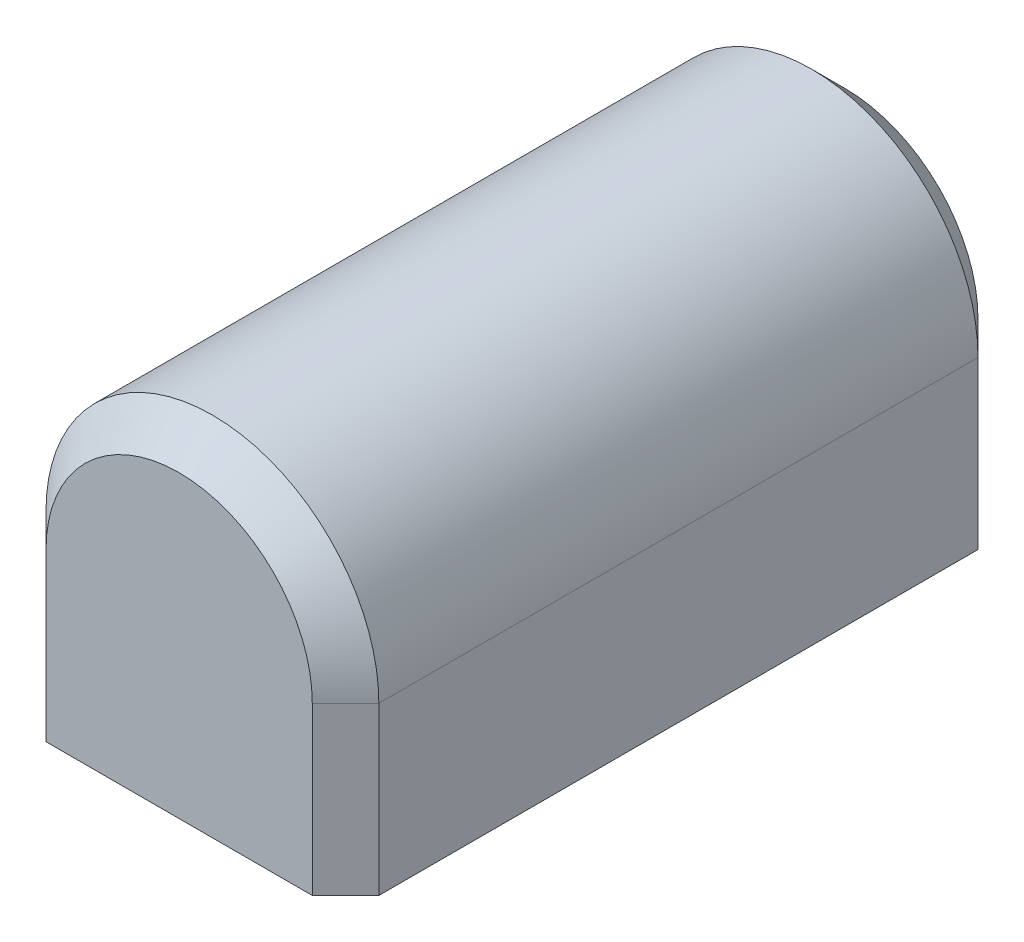
ISO-10303-21;
HEADER;
FILE_DESCRIPTION(('STEP AP214'),'2;1');
FILE_NAME('part.step','',(''),(''),'','','');
FILE_SCHEMA(('AUTOMOTIVE_DESIGN { 1 0 10303 214 1 1 1 1 }'));
ENDSEC;
DATA;
#1=APPLICATION_CONTEXT('core data for automotive mechanical design processes');
#2=APPLICATION_PROTOCOL_DEFINITION('international standard','automotive_design',2000,#1);
#3=PRODUCT_CONTEXT('',#1,'mechanical');
#4=PRODUCT('Part','Part','',(#3));
#5=PRODUCT_RELATED_PRODUCT_CATEGORY('part','',(#4));
#6=PRODUCT_DEFINITION_FORMATION('','',#4);
#7=PRODUCT_DEFINITION_CONTEXT('part definition',#1,'design');
#8=PRODUCT_DEFINITION('design','',#6,#7);
#9=PRODUCT_DEFINITION_SHAPE('','',#8);
#10=(LENGTH_UNIT() NAMED_UNIT(*) SI_UNIT(.MILLI.,.METRE.));
#11=(NAMED_UNIT(*) PLANE_ANGLE_UNIT() SI_UNIT($,.RADIAN.));
#12=(NAMED_UNIT(*) SI_UNIT($,.STERADIAN.) SOLID_ANGLE_UNIT());
#13=UNCERTAINTY_MEASURE_WITH_UNIT(LENGTH_MEASURE(1.E-05),#10,'distance_accuracy_value','');
#14=(GEOMETRIC_REPRESENTATION_CONTEXT(3) GLOBAL_UNCERTAINTY_ASSIGNED_CONTEXT((#13)) GLOBAL_UNIT_ASSIGNED_CONTEXT((#10,
#11,#12)) REPRESENTATION_CONTEXT('',''));
#15=CARTESIAN_POINT('',(0.,0.,0.));
#16=DIRECTION('',(0.,0.,1.));
#17=DIRECTION('',(1.,0.,0.));
#18=AXIS2_PLACEMENT_3D('',#15,#16,#17);
#19=CARTESIAN_POINT('',(5.8,12.7,1.25));
#20=DIRECTION('',(1.,0.,0.));
#21=DIRECTION('',(0.,0.,-1.));
#22=AXIS2_PLACEMENT_3D('',#19,#20,#21);
#23=PLANE('',#22);
#24=DIRECTION('',(0.,0.,-1.));
#25=VECTOR('',#24,1.);
#26=CARTESIAN_POINT('',(5.8,11.7,1.25));
#27=LINE('',#26,#25);
#28=CARTESIAN_POINT('',(5.8,11.7,5.05));
#29=VERTEX_POINT('',#28);
#30=CARTESIAN_POINT('',(5.8,11.7,1.45));
#31=VERTEX_POINT('',#30);
#32=EDGE_CURVE('E11',#29,#31,#27,.T.);
#33=ORIENTED_EDGE('',*,*,#32,.T.);
#34=DIRECTION('',(0.,-1.,0.));
#35=VECTOR('',#34,1.);
#36=CARTESIAN_POINT('',(5.8,12.7,1.45));
#37=LINE('',#36,#35);
#38=CARTESIAN_POINT('',(5.8,10.7,1.45));
#39=VERTEX_POINT('',#38);
#40=EDGE_CURVE('E26',#31,#39,#37,.T.);
#41=ORIENTED_EDGE('',*,*,#40,.T.);
#42=DIRECTION('',(0.,0.,1.));
#43=VECTOR('',#42,1.);
#44=CARTESIAN_POINT('',(5.8,10.7,1.25));
#45=LINE('',#44,#43);
#46=CARTESIAN_POINT('',(5.8,10.7,5.05));
#47=VERTEX_POINT('',#46);
#48=EDGE_CURVE('E127',#39,#47,#45,.T.);
#49=ORIENTED_EDGE('',*,*,#48,.T.);
#50=DIRECTION('',(0.,1.,0.));
#51=VECTOR('',#50,1.);
#52=CARTESIAN_POINT('',(5.8,12.7,5.05));
#53=LINE('',#52,#51);
#54=EDGE_CURVE('E116',#47,#29,#53,.T.);
#55=ORIENTED_EDGE('',*,*,#54,.T.);
#56=EDGE_LOOP('',(#33,#41,#49,#55));
#57=FACE_BOUND('',#56,.T.);
#58=ADVANCED_FACE('F16',(#57),#23,.F.);
#59=CARTESIAN_POINT('',(5.8,12.7,5.25));
#60=DIRECTION('',(0.,0.,-1.));
#61=DIRECTION('',(-1.,0.,0.));
#62=AXIS2_PLACEMENT_3D('',#59,#60,#61);
#63=PLANE('',#62);
#64=CARTESIAN_POINT('',(6.8,11.7,5.25));
#65=DIRECTION('',(0.,0.,1.));
#66=DIRECTION('',(-1.,0.,0.));
#67=AXIS2_PLACEMENT_3D('',#64,#65,#66);
#68=CIRCLE('',#67,0.799999999999999);
#69=CARTESIAN_POINT('',(7.6,11.7,5.25));
#70=VERTEX_POINT('',#69);
#71=CARTESIAN_POINT('',(6.,11.7,5.25));
#72=VERTEX_POINT('',#71);
#73=EDGE_CURVE('E122',#70,#72,#68,.T.);
#74=ORIENTED_EDGE('',*,*,#73,.T.);
#75=DIRECTION('',(0.,-1.,0.));
#76=VECTOR('',#75,1.);
#77=CARTESIAN_POINT('',(6.,12.7,5.25));
#78=LINE('',#77,#76);
#79=CARTESIAN_POINT('',(6.,10.7,5.25));
#80=VERTEX_POINT('',#79);
#81=EDGE_CURVE('E119',#72,#80,#78,.T.);
#82=ORIENTED_EDGE('',*,*,#81,.T.);
#83=DIRECTION('',(1.,0.,0.));
#84=VECTOR('',#83,1.);
#85=CARTESIAN_POINT('',(5.8,10.7,5.25));
#86=LINE('',#85,#84);
#87=CARTESIAN_POINT('',(7.6,10.7,5.25));
#88=VERTEX_POINT('',#87);
#89=EDGE_CURVE('E255',#80,#88,#86,.T.);
#90=ORIENTED_EDGE('',*,*,#89,.T.);
#91=DIRECTION('',(0.,1.,0.));
#92=VECTOR('',#91,1.);
#93=CARTESIAN_POINT('',(7.6,12.7,5.25));
#94=LINE('',#93,#92);
#95=EDGE_CURVE('E234',#88,#70,#94,.T.);
#96=ORIENTED_EDGE('',*,*,#95,.T.);
#97=EDGE_LOOP('',(#74,#82,#90,#96));
#98=FACE_BOUND('',#97,.T.);
#99=ADVANCED_FACE('F146',(#98),#63,.F.);
#100=CARTESIAN_POINT('',(7.8,12.7,1.25));
#101=DIRECTION('',(-1.,0.,0.));
#102=DIRECTION('',(0.,0.,1.));
#103=AXIS2_PLACEMENT_3D('',#100,#101,#102);
#104=PLANE('',#103);
#105=DIRECTION('',(0.,0.,-1.));
#106=VECTOR('',#105,1.);
#107=CARTESIAN_POINT('',(7.8,10.7,1.25));
#108=LINE('',#107,#106);
#109=CARTESIAN_POINT('',(7.8,10.7,5.05));
#110=VERTEX_POINT('',#109);
#111=CARTESIAN_POINT('',(7.8,10.7,1.45));
#112=VERTEX_POINT('',#111);
#113=EDGE_CURVE('E251',#110,#112,#108,.T.);
#114=ORIENTED_EDGE('',*,*,#113,.T.);
#115=DIRECTION('',(0.,1.,0.));
#116=VECTOR('',#115,1.);
#117=CARTESIAN_POINT('',(7.8,12.7,1.45));
#118=LINE('',#117,#116);
#119=CARTESIAN_POINT('',(7.8,11.7,1.45));
#120=VERTEX_POINT('',#119);
#121=EDGE_CURVE('E249',#112,#120,#118,.T.);
#122=ORIENTED_EDGE('',*,*,#121,.T.);
#123=DIRECTION('',(0.,0.,1.));
#124=VECTOR('',#123,1.);
#125=CARTESIAN_POINT('',(7.8,11.7,5.25));
#126=LINE('',#125,#124);
#127=CARTESIAN_POINT('',(7.8,11.7,5.05));
#128=VERTEX_POINT('',#127);
#129=EDGE_CURVE('E132',#120,#128,#126,.T.);
#130=ORIENTED_EDGE('',*,*,#129,.T.);
#131=DIRECTION('',(0.,-1.,0.));
#132=VECTOR('',#131,1.);
#133=CARTESIAN_POINT('',(7.8,12.7,5.05));
#134=LINE('',#133,#132);
#135=EDGE_CURVE('E233',#128,#110,#134,.T.);
#136=ORIENTED_EDGE('',*,*,#135,.T.);
#137=EDGE_LOOP('',(#114,#122,#130,#136));
#138=FACE_BOUND('',#137,.T.);
#139=ADVANCED_FACE('F151',(#138),#104,.F.);
#140=CARTESIAN_POINT('',(5.8,12.7,1.25));
#141=DIRECTION('',(0.,0.,1.));
#142=DIRECTION('',(1.,0.,0.));
#143=AXIS2_PLACEMENT_3D('',#140,#141,#142);
#144=PLANE('',#143);
#145=DIRECTION('',(-1.,0.,0.));
#146=VECTOR('',#145,1.);
#147=CARTESIAN_POINT('',(5.8,10.7,1.25));
#148=LINE('',#147,#146);
#149=CARTESIAN_POINT('',(7.6,10.7,1.25));
#150=VERTEX_POINT('',#149);
#151=CARTESIAN_POINT('',(6.,10.7,1.25));
#152=VERTEX_POINT('',#151);
#153=EDGE_CURVE('E245',#150,#152,#148,.T.);
#154=ORIENTED_EDGE('',*,*,#153,.T.);
#155=DIRECTION('',(0.,1.,0.));
#156=VECTOR('',#155,1.);
#157=CARTESIAN_POINT('',(6.,12.7,1.25));
#158=LINE('',#157,#156);
#159=CARTESIAN_POINT('',(6.,11.7,1.25));
#160=VERTEX_POINT('',#159);
#161=EDGE_CURVE('E87',#152,#160,#158,.T.);
#162=ORIENTED_EDGE('',*,*,#161,.T.);
#163=CARTESIAN_POINT('',(6.8,11.7,1.25));
#164=DIRECTION('',(0.,0.,-1.));
#165=DIRECTION('',(1.,0.,0.));
#166=AXIS2_PLACEMENT_3D('',#163,#164,#165);
#167=CIRCLE('',#166,0.800000000000002);
#168=CARTESIAN_POINT('',(7.6,11.7,1.25));
#169=VERTEX_POINT('',#168);
#170=EDGE_CURVE('E79',#160,#169,#167,.T.);
#171=ORIENTED_EDGE('',*,*,#170,.T.);
#172=DIRECTION('',(0.,-1.,0.));
#173=VECTOR('',#172,1.);
#174=CARTESIAN_POINT('',(7.6,12.7,1.25));
#175=LINE('',#174,#173);
#176=EDGE_CURVE('E85',#169,#150,#175,.T.);
#177=ORIENTED_EDGE('',*,*,#176,.T.);
#178=EDGE_LOOP('',(#154,#162,#171,#177));
#179=FACE_BOUND('',#178,.T.);
#180=ADVANCED_FACE('F84',(#179),#144,.F.);
#181=CARTESIAN_POINT('',(0.,10.7,0.));
#182=DIRECTION('',(0.,1.,0.));
#183=DIRECTION('',(0.,0.,1.));
#184=AXIS2_PLACEMENT_3D('',#181,#182,#183);
#185=PLANE('',#184);
#186=ORIENTED_EDGE('',*,*,#48,.F.);
#187=DIRECTION('',(0.707106781186545,0.,-0.70710678118655));
#188=VECTOR('',#187,1.);
#189=CARTESIAN_POINT('',(5.8,10.7,1.45));
#190=LINE('',#189,#188);
#191=EDGE_CURVE('E97',#39,#152,#190,.T.);
#192=ORIENTED_EDGE('',*,*,#191,.T.);
#193=ORIENTED_EDGE('',*,*,#153,.F.);
#194=DIRECTION('',(0.707106781186545,0.,0.70710678118655));
#195=VECTOR('',#194,1.);
#196=CARTESIAN_POINT('',(7.6,10.7,1.25));
#197=LINE('',#196,#195);
#198=EDGE_CURVE('E96',#150,#112,#197,.T.);
#199=ORIENTED_EDGE('',*,*,#198,.T.);
#200=ORIENTED_EDGE('',*,*,#113,.F.);
#201=DIRECTION('',(-0.707106781186551,0.,0.707106781186544));
#202=VECTOR('',#201,1.);
#203=CARTESIAN_POINT('',(7.8,10.7,5.05));
#204=LINE('',#203,#202);
#205=EDGE_CURVE('E232',#110,#88,#204,.T.);
#206=ORIENTED_EDGE('',*,*,#205,.T.);
#207=ORIENTED_EDGE('',*,*,#89,.F.);
#208=DIRECTION('',(-0.707106781186551,0.,-0.707106781186544));
#209=VECTOR('',#208,1.);
#210=CARTESIAN_POINT('',(6.,10.7,5.25));
#211=LINE('',#210,#209);
#212=EDGE_CURVE('E237',#80,#47,#211,.T.);
#213=ORIENTED_EDGE('',*,*,#212,.T.);
#214=EDGE_LOOP('',(#186,#192,#193,#199,#200,#206,#207,#213));
#215=FACE_BOUND('',#214,.T.);
#216=ADVANCED_FACE('F135',(#215),#185,.F.);
#217=CARTESIAN_POINT('',(6.8,11.7,0.));
#218=DIRECTION('',(0.,0.,1.));
#219=DIRECTION('',(1.,0.,0.));
#220=AXIS2_PLACEMENT_3D('',#217,#218,#219);
#221=CYLINDRICAL_SURFACE('',#220,1.);
#222=ORIENTED_EDGE('',*,*,#129,.F.);
#223=CARTESIAN_POINT('',(6.8,11.7,1.45));
#224=DIRECTION('',(0.,0.,1.));
#225=DIRECTION('',(1.,0.,0.));
#226=AXIS2_PLACEMENT_3D('',#223,#224,#225);
#227=CIRCLE('',#226,1.);
#228=EDGE_CURVE('E35',#120,#31,#227,.T.);
#229=ORIENTED_EDGE('',*,*,#228,.T.);
#230=ORIENTED_EDGE('',*,*,#32,.F.);
#231=CARTESIAN_POINT('',(6.8,11.7,5.05));
#232=DIRECTION('',(0.,0.,-1.));
#233=DIRECTION('',(-1.,0.,0.));
#234=AXIS2_PLACEMENT_3D('',#231,#232,#233);
#235=CIRCLE('',#234,1.);
#236=EDGE_CURVE('E100',#29,#128,#235,.T.);
#237=ORIENTED_EDGE('',*,*,#236,.T.);
#238=EDGE_LOOP('',(#222,#229,#230,#237));
#239=FACE_BOUND('',#238,.T.);
#240=ADVANCED_FACE('F130',(#239),#221,.T.);
#241=CARTESIAN_POINT('',(7.6,12.7,1.25));
#242=DIRECTION('',(-0.70710678118655,0.,0.707106781186545));
#243=DIRECTION('',(0.,-1.,0.));
#244=AXIS2_PLACEMENT_3D('',#241,#242,#243);
#245=PLANE('',#244);
#246=ORIENTED_EDGE('',*,*,#198,.F.);
#247=ORIENTED_EDGE('',*,*,#176,.F.);
#248=DIRECTION('',(-0.707106781186545,0.,-0.70710678118655));
#249=VECTOR('',#248,1.);
#250=CARTESIAN_POINT('',(7.8,11.7,1.45));
#251=LINE('',#250,#249);
#252=EDGE_CURVE('E94',#120,#169,#251,.T.);
#253=ORIENTED_EDGE('',*,*,#252,.F.);
#254=ORIENTED_EDGE('',*,*,#121,.F.);
#255=EDGE_LOOP('',(#246,#247,#253,#254));
#256=FACE_BOUND('',#255,.T.);
#257=ADVANCED_FACE('F93',(#256),#245,.F.);
#258=CARTESIAN_POINT('',(6.8,11.7,1.25));
#259=DIRECTION('',(0.,0.,1.));
#260=DIRECTION('',(1.,0.,0.));
#261=AXIS2_PLACEMENT_3D('',#258,#259,#260);
#262=CONICAL_SURFACE('',#261,0.800000000000001,0.785398163397445);
#263=ORIENTED_EDGE('',*,*,#252,.T.);
#264=ORIENTED_EDGE('',*,*,#170,.F.);
#265=DIRECTION('',(0.707106781186544,0.,-0.707106781186551));
#266=VECTOR('',#265,1.);
#267=CARTESIAN_POINT('',(5.8,11.7,1.45));
#268=LINE('',#267,#266);
#269=EDGE_CURVE('E101',#31,#160,#268,.T.);
#270=ORIENTED_EDGE('',*,*,#269,.F.);
#271=ORIENTED_EDGE('',*,*,#228,.F.);
#272=EDGE_LOOP('',(#263,#264,#270,#271));
#273=FACE_BOUND('',#272,.T.);
#274=ADVANCED_FACE('F99',(#273),#262,.T.);
#275=CARTESIAN_POINT('',(5.8,12.7,1.45));
#276=DIRECTION('',(0.70710678118655,0.,0.707106781186545));
#277=DIRECTION('',(0.,-1.,0.));
#278=AXIS2_PLACEMENT_3D('',#275,#276,#277);
#279=PLANE('',#278);
#280=ORIENTED_EDGE('',*,*,#269,.T.);
#281=ORIENTED_EDGE('',*,*,#161,.F.);
#282=ORIENTED_EDGE('',*,*,#191,.F.);
#283=ORIENTED_EDGE('',*,*,#40,.F.);
#284=EDGE_LOOP('',(#280,#281,#282,#283));
#285=FACE_BOUND('',#284,.T.);
#286=ADVANCED_FACE('F191',(#285),#279,.F.);
#287=CARTESIAN_POINT('',(7.8,12.7,5.05));
#288=DIRECTION('',(-0.707106781186544,0.,-0.707106781186551));
#289=DIRECTION('',(0.,-1.,0.));
#290=AXIS2_PLACEMENT_3D('',#287,#288,#289);
#291=PLANE('',#290);
#292=ORIENTED_EDGE('',*,*,#205,.F.);
#293=ORIENTED_EDGE('',*,*,#135,.F.);
#294=DIRECTION('',(0.707106781186551,0.,-0.707106781186544));
#295=VECTOR('',#294,1.);
#296=CARTESIAN_POINT('',(7.6,11.7,5.25));
#297=LINE('',#296,#295);
#298=EDGE_CURVE('E104',#70,#128,#297,.T.);
#299=ORIENTED_EDGE('',*,*,#298,.F.);
#300=ORIENTED_EDGE('',*,*,#95,.F.);
#301=EDGE_LOOP('',(#292,#293,#299,#300));
#302=FACE_BOUND('',#301,.T.);
#303=ADVANCED_FACE('F200',(#302),#291,.F.);
#304=CARTESIAN_POINT('',(6.8,11.7,5.25));
#305=DIRECTION('',(0.,0.,-1.));
#306=DIRECTION('',(-1.,0.,0.));
#307=AXIS2_PLACEMENT_3D('',#304,#305,#306);
#308=CONICAL_SURFACE('',#307,0.8,0.78539816339745);
#309=ORIENTED_EDGE('',*,*,#298,.T.);
#310=ORIENTED_EDGE('',*,*,#236,.F.);
#311=DIRECTION('',(-0.707106781186551,0.,-0.707106781186544));
#312=VECTOR('',#311,1.);
#313=CARTESIAN_POINT('',(6.,11.7,5.25));
#314=LINE('',#313,#312);
#315=EDGE_CURVE('E20',#72,#29,#314,.T.);
#316=ORIENTED_EDGE('',*,*,#315,.F.);
#317=ORIENTED_EDGE('',*,*,#73,.F.);
#318=EDGE_LOOP('',(#309,#310,#316,#317));
#319=FACE_BOUND('',#318,.T.);
#320=ADVANCED_FACE('F121',(#319),#308,.T.);
#321=CARTESIAN_POINT('',(6.,12.7,5.25));
#322=DIRECTION('',(0.707106781186544,0.,-0.707106781186551));
#323=DIRECTION('',(0.,-1.,0.));
#324=AXIS2_PLACEMENT_3D('',#321,#322,#323);
#325=PLANE('',#324);
#326=ORIENTED_EDGE('',*,*,#315,.T.);
#327=ORIENTED_EDGE('',*,*,#54,.F.);
#328=ORIENTED_EDGE('',*,*,#212,.F.);
#329=ORIENTED_EDGE('',*,*,#81,.F.);
#330=EDGE_LOOP('',(#326,#327,#328,#329));
#331=FACE_BOUND('',#330,.T.);
#332=ADVANCED_FACE('F18',(#331),#325,.F.);
#333=CLOSED_SHELL('',(#58,#99,#139,#180,#216,#240,#257,#274,#286,#303,#320,#332));
#334=MANIFOLD_SOLID_BREP('B1',#333);
#335=ADVANCED_BREP_SHAPE_REPRESENTATION('',(#18,#334),#14);
#336=SHAPE_DEFINITION_REPRESENTATION(#9,#335);
ENDSEC;
END-ISO-10303-21;
